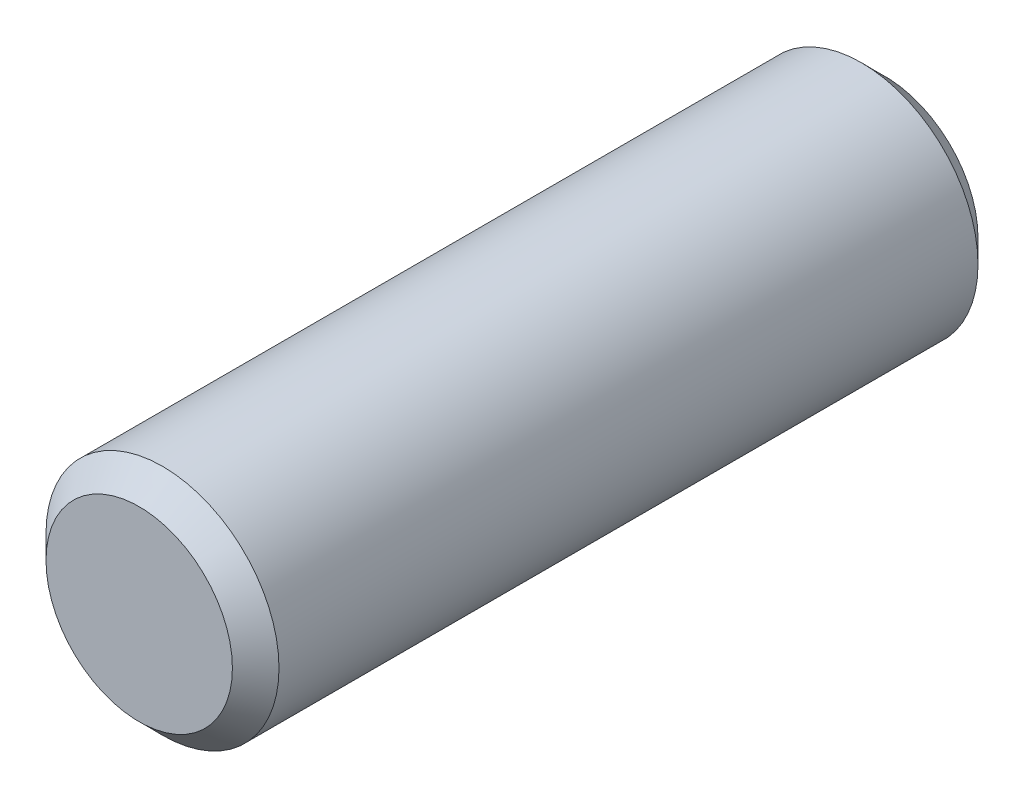
ISO-10303-21;
HEADER;
FILE_DESCRIPTION(('STEP AP214'),'2;1');
FILE_NAME('part.step','',(''),(''),'','','');
FILE_SCHEMA(('AUTOMOTIVE_DESIGN { 1 0 10303 214 1 1 1 1 }'));
ENDSEC;
DATA;
#1=APPLICATION_CONTEXT('core data for automotive mechanical design processes');
#2=APPLICATION_PROTOCOL_DEFINITION('international standard','automotive_design',2000,#1);
#3=PRODUCT_CONTEXT('',#1,'mechanical');
#4=PRODUCT('Part','Part','',(#3));
#5=PRODUCT_RELATED_PRODUCT_CATEGORY('part','',(#4));
#6=PRODUCT_DEFINITION_FORMATION('','',#4);
#7=PRODUCT_DEFINITION_CONTEXT('part definition',#1,'design');
#8=PRODUCT_DEFINITION('design','',#6,#7);
#9=PRODUCT_DEFINITION_SHAPE('','',#8);
#10=(LENGTH_UNIT() NAMED_UNIT(*) SI_UNIT(.MILLI.,.METRE.));
#11=(NAMED_UNIT(*) PLANE_ANGLE_UNIT() SI_UNIT($,.RADIAN.));
#12=(NAMED_UNIT(*) SI_UNIT($,.STERADIAN.) SOLID_ANGLE_UNIT());
#13=UNCERTAINTY_MEASURE_WITH_UNIT(LENGTH_MEASURE(1.E-05),#10,'distance_accuracy_value','');
#14=(GEOMETRIC_REPRESENTATION_CONTEXT(3) GLOBAL_UNCERTAINTY_ASSIGNED_CONTEXT((#13)) GLOBAL_UNIT_ASSIGNED_CONTEXT((#10,
#11,#12)) REPRESENTATION_CONTEXT('',''));
#15=CARTESIAN_POINT('',(0.,0.,0.));
#16=DIRECTION('',(0.,0.,1.));
#17=DIRECTION('',(1.,0.,0.));
#18=AXIS2_PLACEMENT_3D('',#15,#16,#17);
#19=CARTESIAN_POINT('',(0.,0.,32.));
#20=DIRECTION('',(0.,0.,-1.));
#21=DIRECTION('',(-1.,0.,0.));
#22=AXIS2_PLACEMENT_3D('',#19,#20,#21);
#23=CYLINDRICAL_SURFACE('',#22,5.);
#24=CARTESIAN_POINT('',(0.,0.,1.));
#25=DIRECTION('',(0.,0.,1.));
#26=DIRECTION('',(1.,0.,0.));
#27=AXIS2_PLACEMENT_3D('',#24,#25,#26);
#28=CIRCLE('',#27,5.);
#29=CARTESIAN_POINT('',(5.,0.,1.));
#30=VERTEX_POINT('',#29);
#31=EDGE_CURVE('E51',#30,#30,#28,.T.);
#32=ORIENTED_EDGE('',*,*,#31,.T.);
#33=EDGE_LOOP('',(#32));
#34=FACE_BOUND('',#33,.T.);
#35=CARTESIAN_POINT('',(0.,0.,31.));
#36=DIRECTION('',(0.,0.,1.));
#37=DIRECTION('',(1.,0.,0.));
#38=AXIS2_PLACEMENT_3D('',#35,#36,#37);
#39=CIRCLE('',#38,5.);
#40=CARTESIAN_POINT('',(5.,0.,31.));
#41=VERTEX_POINT('',#40);
#42=EDGE_CURVE('E55',#41,#41,#39,.F.);
#43=ORIENTED_EDGE('',*,*,#42,.T.);
#44=EDGE_LOOP('',(#43));
#45=FACE_BOUND('',#44,.T.);
#46=ADVANCED_FACE('F39',(#34,#45),#23,.T.);
#47=CARTESIAN_POINT('',(0.,0.,32.));
#48=DIRECTION('',(0.,0.,1.));
#49=DIRECTION('',(1.,0.,0.));
#50=AXIS2_PLACEMENT_3D('',#47,#48,#49);
#51=PLANE('',#50);
#52=CARTESIAN_POINT('',(0.,0.,32.));
#53=DIRECTION('',(0.,0.,1.));
#54=DIRECTION('',(1.,0.,0.));
#55=AXIS2_PLACEMENT_3D('',#52,#53,#54);
#56=CIRCLE('',#55,4.);
#57=CARTESIAN_POINT('',(4.,0.,32.));
#58=VERTEX_POINT('',#57);
#59=EDGE_CURVE('E10',#58,#58,#56,.T.);
#60=ORIENTED_EDGE('',*,*,#59,.T.);
#61=EDGE_LOOP('',(#60));
#62=FACE_BOUND('',#61,.T.);
#63=ADVANCED_FACE('F71',(#62),#51,.T.);
#64=CARTESIAN_POINT('',(0.,0.,0.));
#65=DIRECTION('',(0.,0.,1.));
#66=DIRECTION('',(1.,0.,0.));
#67=AXIS2_PLACEMENT_3D('',#64,#65,#66);
#68=PLANE('',#67);
#69=CARTESIAN_POINT('',(0.,0.,0.));
#70=DIRECTION('',(0.,0.,1.));
#71=DIRECTION('',(1.,0.,0.));
#72=AXIS2_PLACEMENT_3D('',#69,#70,#71);
#73=CIRCLE('',#72,3.99999999999999);
#74=CARTESIAN_POINT('',(3.99999999999999,0.,0.));
#75=VERTEX_POINT('',#74);
#76=EDGE_CURVE('E47',#75,#75,#73,.F.);
#77=ORIENTED_EDGE('',*,*,#76,.T.);
#78=EDGE_LOOP('',(#77));
#79=FACE_BOUND('',#78,.T.);
#80=ADVANCED_FACE('F68',(#79),#68,.F.);
#81=CARTESIAN_POINT('',(0.,0.,1.));
#82=DIRECTION('',(0.,0.,1.));
#83=DIRECTION('',(1.,0.,0.));
#84=AXIS2_PLACEMENT_3D('',#81,#82,#83);
#85=CONICAL_SURFACE('',#84,5.,0.785398163397451);
#86=ORIENTED_EDGE('',*,*,#76,.F.);
#87=EDGE_LOOP('',(#86));
#88=FACE_BOUND('',#87,.T.);
#89=ORIENTED_EDGE('',*,*,#31,.F.);
#90=EDGE_LOOP('',(#89));
#91=FACE_BOUND('',#90,.T.);
#92=ADVANCED_FACE('F64',(#88,#91),#85,.T.);
#93=CARTESIAN_POINT('',(0.,0.,32.));
#94=DIRECTION('',(0.,0.,-1.));
#95=DIRECTION('',(-1.,0.,0.));
#96=AXIS2_PLACEMENT_3D('',#93,#94,#95);
#97=CONICAL_SURFACE('',#96,4.,0.785398163397446);
#98=ORIENTED_EDGE('',*,*,#42,.F.);
#99=EDGE_LOOP('',(#98));
#100=FACE_BOUND('',#99,.T.);
#101=ORIENTED_EDGE('',*,*,#59,.F.);
#102=EDGE_LOOP('',(#101));
#103=FACE_BOUND('',#102,.T.);
#104=ADVANCED_FACE('F42',(#100,#103),#97,.T.);
#105=CLOSED_SHELL('',(#46,#63,#80,#92,#104));
#106=MANIFOLD_SOLID_BREP('B2',#105);
#107=ADVANCED_BREP_SHAPE_REPRESENTATION('',(#18,#106),#14);
#108=SHAPE_DEFINITION_REPRESENTATION(#9,#107);
ENDSEC;
END-ISO-10303-21;
